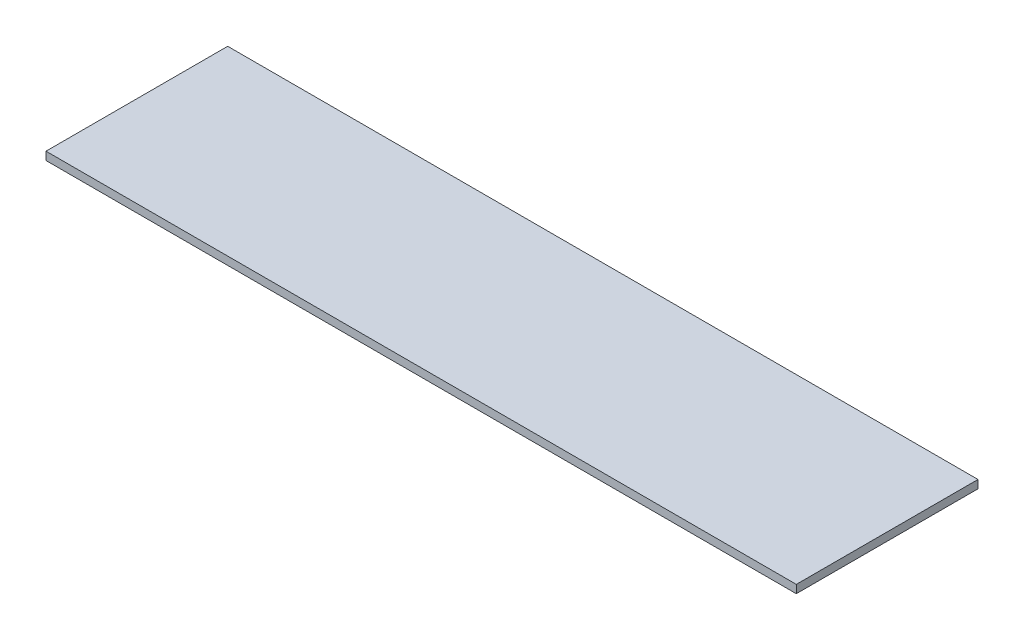
ISO-10303-21;
HEADER;
FILE_DESCRIPTION(('STEP AP214'),'2;1');
FILE_NAME('part.step','',(''),(''),'','','');
FILE_SCHEMA(('AUTOMOTIVE_DESIGN { 1 0 10303 214 1 1 1 1 }'));
ENDSEC;
DATA;
#1=APPLICATION_CONTEXT('core data for automotive mechanical design processes');
#2=APPLICATION_PROTOCOL_DEFINITION('international standard','automotive_design',2000,#1);
#3=PRODUCT_CONTEXT('',#1,'mechanical');
#4=PRODUCT('Part','Part','',(#3));
#5=PRODUCT_RELATED_PRODUCT_CATEGORY('part','',(#4));
#6=PRODUCT_DEFINITION_FORMATION('','',#4);
#7=PRODUCT_DEFINITION_CONTEXT('part definition',#1,'design');
#8=PRODUCT_DEFINITION('design','',#6,#7);
#9=PRODUCT_DEFINITION_SHAPE('','',#8);
#10=(LENGTH_UNIT() NAMED_UNIT(*) SI_UNIT(.MILLI.,.METRE.));
#11=(NAMED_UNIT(*) PLANE_ANGLE_UNIT() SI_UNIT($,.RADIAN.));
#12=(NAMED_UNIT(*) SI_UNIT($,.STERADIAN.) SOLID_ANGLE_UNIT());
#13=UNCERTAINTY_MEASURE_WITH_UNIT(LENGTH_MEASURE(1.E-05),#10,'distance_accuracy_value','');
#14=(GEOMETRIC_REPRESENTATION_CONTEXT(3) GLOBAL_UNCERTAINTY_ASSIGNED_CONTEXT((#13)) GLOBAL_UNIT_ASSIGNED_CONTEXT((#10,
#11,#12)) REPRESENTATION_CONTEXT('',''));
#15=CARTESIAN_POINT('',(0.,0.,0.));
#16=DIRECTION('',(0.,0.,1.));
#17=DIRECTION('',(1.,0.,0.));
#18=AXIS2_PLACEMENT_3D('',#15,#16,#17);
#19=CARTESIAN_POINT('',(92.5,2.,-22.4));
#20=DIRECTION('',(-1.,0.,0.));
#21=DIRECTION('',(0.,0.,1.));
#22=AXIS2_PLACEMENT_3D('',#19,#20,#21);
#23=PLANE('',#22);
#24=DIRECTION('',(0.,0.,-1.));
#25=VECTOR('',#24,1.);
#26=CARTESIAN_POINT('',(92.5,0.,-22.4));
#27=LINE('',#26,#25);
#28=CARTESIAN_POINT('',(92.5,0.,22.4));
#29=VERTEX_POINT('',#28);
#30=CARTESIAN_POINT('',(92.5,0.,-22.4));
#31=VERTEX_POINT('',#30);
#32=EDGE_CURVE('E113',#29,#31,#27,.T.);
#33=ORIENTED_EDGE('',*,*,#32,.T.);
#34=DIRECTION('',(0.,-1.,0.));
#35=VECTOR('',#34,1.);
#36=CARTESIAN_POINT('',(92.5,2.,-22.4));
#37=LINE('',#36,#35);
#38=CARTESIAN_POINT('',(92.5,2.,-22.4));
#39=VERTEX_POINT('',#38);
#40=EDGE_CURVE('E11',#39,#31,#37,.T.);
#41=ORIENTED_EDGE('',*,*,#40,.F.);
#42=DIRECTION('',(0.,0.,-1.));
#43=VECTOR('',#42,1.);
#44=CARTESIAN_POINT('',(92.5,2.,-22.4));
#45=LINE('',#44,#43);
#46=CARTESIAN_POINT('',(92.5,2.,22.4));
#47=VERTEX_POINT('',#46);
#48=EDGE_CURVE('E97',#47,#39,#45,.T.);
#49=ORIENTED_EDGE('',*,*,#48,.F.);
#50=DIRECTION('',(0.,-1.,0.));
#51=VECTOR('',#50,1.);
#52=CARTESIAN_POINT('',(92.5,2.,22.4));
#53=LINE('',#52,#51);
#54=EDGE_CURVE('E109',#47,#29,#53,.T.);
#55=ORIENTED_EDGE('',*,*,#54,.T.);
#56=EDGE_LOOP('',(#33,#41,#49,#55));
#57=FACE_BOUND('',#56,.T.);
#58=ADVANCED_FACE('F45',(#57),#23,.F.);
#59=CARTESIAN_POINT('',(-92.5,2.,-22.4));
#60=DIRECTION('',(0.,0.,1.));
#61=DIRECTION('',(1.,0.,0.));
#62=AXIS2_PLACEMENT_3D('',#59,#60,#61);
#63=PLANE('',#62);
#64=DIRECTION('',(-1.,0.,0.));
#65=VECTOR('',#64,1.);
#66=CARTESIAN_POINT('',(-92.5,0.,-22.4));
#67=LINE('',#66,#65);
#68=CARTESIAN_POINT('',(-92.5,0.,-22.4));
#69=VERTEX_POINT('',#68);
#70=EDGE_CURVE('E102',#31,#69,#67,.T.);
#71=ORIENTED_EDGE('',*,*,#70,.T.);
#72=DIRECTION('',(0.,-1.,0.));
#73=VECTOR('',#72,1.);
#74=CARTESIAN_POINT('',(-92.5,2.,-22.4));
#75=LINE('',#74,#73);
#76=CARTESIAN_POINT('',(-92.5,2.,-22.4));
#77=VERTEX_POINT('',#76);
#78=EDGE_CURVE('E54',#77,#69,#75,.T.);
#79=ORIENTED_EDGE('',*,*,#78,.F.);
#80=DIRECTION('',(-1.,0.,0.));
#81=VECTOR('',#80,1.);
#82=CARTESIAN_POINT('',(-92.5,2.,-22.4));
#83=LINE('',#82,#81);
#84=EDGE_CURVE('E92',#39,#77,#83,.T.);
#85=ORIENTED_EDGE('',*,*,#84,.F.);
#86=ORIENTED_EDGE('',*,*,#40,.T.);
#87=EDGE_LOOP('',(#71,#79,#85,#86));
#88=FACE_BOUND('',#87,.T.);
#89=ADVANCED_FACE('F101',(#88),#63,.F.);
#90=CARTESIAN_POINT('',(-92.5,2.,-22.4));
#91=DIRECTION('',(1.,0.,0.));
#92=DIRECTION('',(0.,0.,-1.));
#93=AXIS2_PLACEMENT_3D('',#90,#91,#92);
#94=PLANE('',#93);
#95=DIRECTION('',(0.,0.,1.));
#96=VECTOR('',#95,1.);
#97=CARTESIAN_POINT('',(-92.5,0.,-22.4));
#98=LINE('',#97,#96);
#99=CARTESIAN_POINT('',(-92.5,0.,22.4));
#100=VERTEX_POINT('',#99);
#101=EDGE_CURVE('E79',#69,#100,#98,.T.);
#102=ORIENTED_EDGE('',*,*,#101,.T.);
#103=DIRECTION('',(0.,-1.,0.));
#104=VECTOR('',#103,1.);
#105=CARTESIAN_POINT('',(-92.5,2.,22.4));
#106=LINE('',#105,#104);
#107=CARTESIAN_POINT('',(-92.5,2.,22.4));
#108=VERTEX_POINT('',#107);
#109=EDGE_CURVE('E104',#108,#100,#106,.T.);
#110=ORIENTED_EDGE('',*,*,#109,.F.);
#111=DIRECTION('',(0.,0.,1.));
#112=VECTOR('',#111,1.);
#113=CARTESIAN_POINT('',(-92.5,2.,-22.4));
#114=LINE('',#113,#112);
#115=EDGE_CURVE('E95',#77,#108,#114,.T.);
#116=ORIENTED_EDGE('',*,*,#115,.F.);
#117=ORIENTED_EDGE('',*,*,#78,.T.);
#118=EDGE_LOOP('',(#102,#110,#116,#117));
#119=FACE_BOUND('',#118,.T.);
#120=ADVANCED_FACE('F105',(#119),#94,.F.);
#121=CARTESIAN_POINT('',(-92.5,2.,22.4));
#122=DIRECTION('',(0.,0.,-1.));
#123=DIRECTION('',(-1.,0.,0.));
#124=AXIS2_PLACEMENT_3D('',#121,#122,#123);
#125=PLANE('',#124);
#126=DIRECTION('',(1.,0.,0.));
#127=VECTOR('',#126,1.);
#128=CARTESIAN_POINT('',(-92.5,0.,22.4));
#129=LINE('',#128,#127);
#130=EDGE_CURVE('E85',#100,#29,#129,.T.);
#131=ORIENTED_EDGE('',*,*,#130,.T.);
#132=ORIENTED_EDGE('',*,*,#54,.F.);
#133=DIRECTION('',(1.,0.,0.));
#134=VECTOR('',#133,1.);
#135=CARTESIAN_POINT('',(-92.5,2.,22.4));
#136=LINE('',#135,#134);
#137=EDGE_CURVE('E62',#108,#47,#136,.T.);
#138=ORIENTED_EDGE('',*,*,#137,.F.);
#139=ORIENTED_EDGE('',*,*,#109,.T.);
#140=EDGE_LOOP('',(#131,#132,#138,#139));
#141=FACE_BOUND('',#140,.T.);
#142=ADVANCED_FACE('F126',(#141),#125,.F.);
#143=CARTESIAN_POINT('',(0.,2.,0.));
#144=DIRECTION('',(0.,1.,0.));
#145=DIRECTION('',(0.,0.,1.));
#146=AXIS2_PLACEMENT_3D('',#143,#144,#145);
#147=PLANE('',#146);
#148=ORIENTED_EDGE('',*,*,#48,.T.);
#149=ORIENTED_EDGE('',*,*,#84,.T.);
#150=ORIENTED_EDGE('',*,*,#115,.T.);
#151=ORIENTED_EDGE('',*,*,#137,.T.);
#152=EDGE_LOOP('',(#148,#149,#150,#151));
#153=FACE_BOUND('',#152,.T.);
#154=ADVANCED_FACE('F93',(#153),#147,.T.);
#155=CARTESIAN_POINT('',(0.,0.,0.));
#156=DIRECTION('',(0.,1.,0.));
#157=DIRECTION('',(0.,0.,1.));
#158=AXIS2_PLACEMENT_3D('',#155,#156,#157);
#159=PLANE('',#158);
#160=ORIENTED_EDGE('',*,*,#32,.F.);
#161=ORIENTED_EDGE('',*,*,#130,.F.);
#162=ORIENTED_EDGE('',*,*,#101,.F.);
#163=ORIENTED_EDGE('',*,*,#70,.F.);
#164=EDGE_LOOP('',(#160,#161,#162,#163));
#165=FACE_BOUND('',#164,.T.);
#166=ADVANCED_FACE('F129',(#165),#159,.F.);
#167=CLOSED_SHELL('',(#58,#89,#120,#142,#154,#166));
#168=MANIFOLD_SOLID_BREP('B2',#167);
#169=ADVANCED_BREP_SHAPE_REPRESENTATION('',(#18,#168),#14);
#170=SHAPE_DEFINITION_REPRESENTATION(#9,#169);
ENDSEC;
END-ISO-10303-21;
